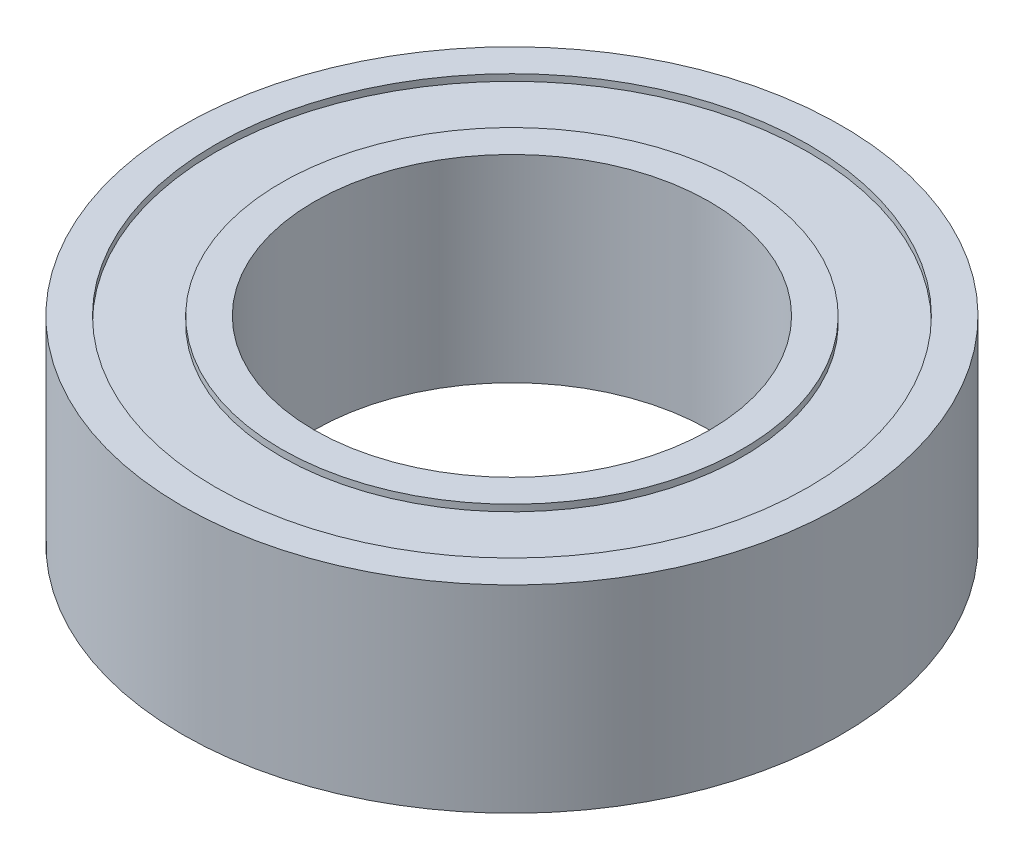
ISO-10303-21;
HEADER;
FILE_DESCRIPTION(('STEP AP214'),'2;1');
FILE_NAME('part.step','',(''),(''),'','','');
FILE_SCHEMA(('AUTOMOTIVE_DESIGN { 1 0 10303 214 1 1 1 1 }'));
ENDSEC;
DATA;
#1=APPLICATION_CONTEXT('core data for automotive mechanical design processes');
#2=APPLICATION_PROTOCOL_DEFINITION('international standard','automotive_design',2000,#1);
#3=PRODUCT_CONTEXT('',#1,'mechanical');
#4=PRODUCT('Part','Part','',(#3));
#5=PRODUCT_RELATED_PRODUCT_CATEGORY('part','',(#4));
#6=PRODUCT_DEFINITION_FORMATION('','',#4);
#7=PRODUCT_DEFINITION_CONTEXT('part definition',#1,'design');
#8=PRODUCT_DEFINITION('design','',#6,#7);
#9=PRODUCT_DEFINITION_SHAPE('','',#8);
#10=(LENGTH_UNIT() NAMED_UNIT(*) SI_UNIT(.MILLI.,.METRE.));
#11=(NAMED_UNIT(*) PLANE_ANGLE_UNIT() SI_UNIT($,.RADIAN.));
#12=(NAMED_UNIT(*) SI_UNIT($,.STERADIAN.) SOLID_ANGLE_UNIT());
#13=UNCERTAINTY_MEASURE_WITH_UNIT(LENGTH_MEASURE(1.E-05),#10,'distance_accuracy_value','');
#14=(GEOMETRIC_REPRESENTATION_CONTEXT(3) GLOBAL_UNCERTAINTY_ASSIGNED_CONTEXT((#13)) GLOBAL_UNIT_ASSIGNED_CONTEXT((#10,
#11,#12)) REPRESENTATION_CONTEXT('',''));
#15=CARTESIAN_POINT('',(0.,0.,0.));
#16=DIRECTION('',(0.,0.,1.));
#17=DIRECTION('',(1.,0.,0.));
#18=AXIS2_PLACEMENT_3D('',#15,#16,#17);
#19=CARTESIAN_POINT('',(0.,0.,0.));
#20=DIRECTION('',(0.,1.,0.));
#21=DIRECTION('',(0.,0.,1.));
#22=AXIS2_PLACEMENT_3D('',#19,#20,#21);
#23=PLANE('',#22);
#24=CARTESIAN_POINT('',(0.,0.,0.));
#25=DIRECTION('',(0.,1.,0.));
#26=DIRECTION('',(0.,0.,1.));
#27=AXIS2_PLACEMENT_3D('',#24,#25,#26);
#28=CIRCLE('',#27,3.);
#29=CARTESIAN_POINT('',(0.,0.,3.));
#30=VERTEX_POINT('',#29);
#31=EDGE_CURVE('E50',#30,#30,#28,.F.);
#32=ORIENTED_EDGE('',*,*,#31,.F.);
#33=EDGE_LOOP('',(#32));
#34=FACE_BOUND('',#33,.T.);
#35=CARTESIAN_POINT('',(0.,0.,0.));
#36=DIRECTION('',(0.,-1.,0.));
#37=DIRECTION('',(0.,0.,-1.));
#38=AXIS2_PLACEMENT_3D('',#35,#36,#37);
#39=CIRCLE('',#38,3.5);
#40=CARTESIAN_POINT('',(0.,0.,-3.5));
#41=VERTEX_POINT('',#40);
#42=EDGE_CURVE('E84',#41,#41,#39,.T.);
#43=ORIENTED_EDGE('',*,*,#42,.T.);
#44=EDGE_LOOP('',(#43));
#45=FACE_BOUND('',#44,.T.);
#46=ADVANCED_FACE('F37',(#34,#45),#23,.F.);
#47=CARTESIAN_POINT('',(0.,3.,0.));
#48=DIRECTION('',(0.,1.,0.));
#49=DIRECTION('',(0.,0.,1.));
#50=AXIS2_PLACEMENT_3D('',#47,#48,#49);
#51=PLANE('',#50);
#52=CARTESIAN_POINT('',(0.,3.,0.));
#53=DIRECTION('',(0.,1.,0.));
#54=DIRECTION('',(0.,0.,1.));
#55=AXIS2_PLACEMENT_3D('',#52,#53,#54);
#56=CIRCLE('',#55,3.);
#57=CARTESIAN_POINT('',(0.,3.,3.));
#58=VERTEX_POINT('',#57);
#59=EDGE_CURVE('E55',#58,#58,#56,.T.);
#60=ORIENTED_EDGE('',*,*,#59,.F.);
#61=EDGE_LOOP('',(#60));
#62=FACE_BOUND('',#61,.T.);
#63=CARTESIAN_POINT('',(0.,3.,0.));
#64=DIRECTION('',(0.,1.,0.));
#65=DIRECTION('',(0.,0.,1.));
#66=AXIS2_PLACEMENT_3D('',#63,#64,#65);
#67=CIRCLE('',#66,3.5);
#68=CARTESIAN_POINT('',(0.,3.,3.5));
#69=VERTEX_POINT('',#68);
#70=EDGE_CURVE('E68',#69,#69,#67,.T.);
#71=ORIENTED_EDGE('',*,*,#70,.T.);
#72=EDGE_LOOP('',(#71));
#73=FACE_BOUND('',#72,.T.);
#74=ADVANCED_FACE('F116',(#62,#73),#51,.T.);
#75=CARTESIAN_POINT('',(0.,3.,0.));
#76=DIRECTION('',(0.,-1.,0.));
#77=DIRECTION('',(0.,0.,-1.));
#78=AXIS2_PLACEMENT_3D('',#75,#76,#77);
#79=CYLINDRICAL_SURFACE('',#78,5.);
#80=CARTESIAN_POINT('',(0.,3.,0.));
#81=DIRECTION('',(0.,1.,0.));
#82=DIRECTION('',(0.,0.,1.));
#83=AXIS2_PLACEMENT_3D('',#80,#81,#82);
#84=CIRCLE('',#83,5.);
#85=CARTESIAN_POINT('',(0.,3.,5.));
#86=VERTEX_POINT('',#85);
#87=EDGE_CURVE('E10',#86,#86,#84,.T.);
#88=ORIENTED_EDGE('',*,*,#87,.F.);
#89=EDGE_LOOP('',(#88));
#90=FACE_BOUND('',#89,.T.);
#91=CARTESIAN_POINT('',(0.,0.,0.));
#92=DIRECTION('',(0.,1.,0.));
#93=DIRECTION('',(0.,0.,1.));
#94=AXIS2_PLACEMENT_3D('',#91,#92,#93);
#95=CIRCLE('',#94,5.);
#96=CARTESIAN_POINT('',(0.,0.,5.));
#97=VERTEX_POINT('',#96);
#98=EDGE_CURVE('E41',#97,#97,#95,.T.);
#99=ORIENTED_EDGE('',*,*,#98,.T.);
#100=EDGE_LOOP('',(#99));
#101=FACE_BOUND('',#100,.T.);
#102=ADVANCED_FACE('F39',(#90,#101),#79,.T.);
#103=CARTESIAN_POINT('',(0.,3.,0.));
#104=DIRECTION('',(0.,1.,0.));
#105=DIRECTION('',(0.,0.,1.));
#106=AXIS2_PLACEMENT_3D('',#103,#104,#105);
#107=CIRCLE('',#106,4.5);
#108=CARTESIAN_POINT('',(0.,3.,4.5));
#109=VERTEX_POINT('',#108);
#110=EDGE_CURVE('E60',#109,#109,#107,.T.);
#111=ORIENTED_EDGE('',*,*,#110,.F.);
#112=EDGE_LOOP('',(#111));
#113=FACE_BOUND('',#112,.T.);
#114=ORIENTED_EDGE('',*,*,#87,.T.);
#115=EDGE_LOOP('',(#114));
#116=FACE_BOUND('',#115,.T.);
#117=ADVANCED_FACE('F112',(#113,#116),#51,.T.);
#118=CARTESIAN_POINT('',(0.,0.,0.));
#119=DIRECTION('',(0.,-1.,0.));
#120=DIRECTION('',(0.,0.,-1.));
#121=AXIS2_PLACEMENT_3D('',#118,#119,#120);
#122=CIRCLE('',#121,4.5);
#123=CARTESIAN_POINT('',(0.,0.,-4.5));
#124=VERTEX_POINT('',#123);
#125=EDGE_CURVE('E76',#124,#124,#122,.T.);
#126=ORIENTED_EDGE('',*,*,#125,.F.);
#127=EDGE_LOOP('',(#126));
#128=FACE_BOUND('',#127,.T.);
#129=ORIENTED_EDGE('',*,*,#98,.F.);
#130=EDGE_LOOP('',(#129));
#131=FACE_BOUND('',#130,.T.);
#132=ADVANCED_FACE('F108',(#128,#131),#23,.F.);
#133=CARTESIAN_POINT('',(0.,-0.00100000000000013,0.));
#134=DIRECTION('',(0.,1.,0.));
#135=DIRECTION('',(0.,0.,1.));
#136=AXIS2_PLACEMENT_3D('',#133,#134,#135);
#137=CYLINDRICAL_SURFACE('',#136,3.);
#138=CARTESIAN_POINT('',(0.,3.,3.));
#139=CARTESIAN_POINT('',(0.,2.96875,3.));
#140=CARTESIAN_POINT('',(0.,2.9375,3.));
#141=CARTESIAN_POINT('',(0.,2.875,3.));
#142=CARTESIAN_POINT('',(0.,2.84375,3.));
#143=CARTESIAN_POINT('',(0.,2.78125,3.));
#144=CARTESIAN_POINT('',(0.,2.75,3.));
#145=CARTESIAN_POINT('',(0.,2.6875,3.));
#146=CARTESIAN_POINT('',(0.,2.65625,3.));
#147=CARTESIAN_POINT('',(0.,2.59375,3.));
#148=CARTESIAN_POINT('',(0.,2.5625,3.));
#149=CARTESIAN_POINT('',(0.,2.5,3.));
#150=CARTESIAN_POINT('',(0.,2.46875,3.));
#151=CARTESIAN_POINT('',(0.,2.40625,3.));
#152=CARTESIAN_POINT('',(0.,2.375,3.));
#153=CARTESIAN_POINT('',(0.,2.3125,3.));
#154=CARTESIAN_POINT('',(0.,2.28125,3.));
#155=CARTESIAN_POINT('',(0.,2.21875,3.));
#156=CARTESIAN_POINT('',(0.,2.1875,3.));
#157=CARTESIAN_POINT('',(0.,2.125,3.));
#158=CARTESIAN_POINT('',(0.,2.09375,3.));
#159=CARTESIAN_POINT('',(0.,2.03125,3.));
#160=CARTESIAN_POINT('',(0.,2.,3.));
#161=CARTESIAN_POINT('',(0.,1.9375,3.));
#162=CARTESIAN_POINT('',(0.,1.90625,3.));
#163=CARTESIAN_POINT('',(0.,1.84375,3.));
#164=CARTESIAN_POINT('',(0.,1.8125,3.));
#165=CARTESIAN_POINT('',(0.,1.75,3.));
#166=CARTESIAN_POINT('',(0.,1.71875,3.));
#167=CARTESIAN_POINT('',(0.,1.65625,3.));
#168=CARTESIAN_POINT('',(0.,1.625,3.));
#169=CARTESIAN_POINT('',(0.,1.5625,3.));
#170=CARTESIAN_POINT('',(0.,1.53125,3.));
#171=CARTESIAN_POINT('',(0.,1.46875,3.));
#172=CARTESIAN_POINT('',(0.,1.4375,3.));
#173=CARTESIAN_POINT('',(0.,1.375,3.));
#174=CARTESIAN_POINT('',(0.,1.34375,3.));
#175=CARTESIAN_POINT('',(0.,1.28125,3.));
#176=CARTESIAN_POINT('',(0.,1.25,3.));
#177=CARTESIAN_POINT('',(0.,1.1875,3.));
#178=CARTESIAN_POINT('',(0.,1.15625,3.));
#179=CARTESIAN_POINT('',(0.,1.09375,3.));
#180=CARTESIAN_POINT('',(0.,1.0625,3.));
#181=CARTESIAN_POINT('',(0.,1.,3.));
#182=CARTESIAN_POINT('',(0.,0.96875,3.));
#183=CARTESIAN_POINT('',(0.,0.90625,3.));
#184=CARTESIAN_POINT('',(0.,0.875,3.));
#185=CARTESIAN_POINT('',(0.,0.8125,3.));
#186=CARTESIAN_POINT('',(0.,0.78125,3.));
#187=CARTESIAN_POINT('',(0.,0.71875,3.));
#188=CARTESIAN_POINT('',(0.,0.6875,3.));
#189=CARTESIAN_POINT('',(0.,0.625,3.));
#190=CARTESIAN_POINT('',(0.,0.59375,3.));
#191=CARTESIAN_POINT('',(0.,0.53125,3.));
#192=CARTESIAN_POINT('',(0.,0.5,3.));
#193=CARTESIAN_POINT('',(0.,0.4375,3.));
#194=CARTESIAN_POINT('',(0.,0.40625,3.));
#195=CARTESIAN_POINT('',(0.,0.34375,3.));
#196=CARTESIAN_POINT('',(0.,0.3125,3.));
#197=CARTESIAN_POINT('',(0.,0.25,3.));
#198=CARTESIAN_POINT('',(0.,0.21875,3.));
#199=CARTESIAN_POINT('',(0.,0.15625,3.));
#200=CARTESIAN_POINT('',(0.,0.125,3.));
#201=CARTESIAN_POINT('',(0.,0.0625000000000001,3.));
#202=CARTESIAN_POINT('',(0.,0.0312500000000001,3.));
#203=CARTESIAN_POINT('',(0.,0.,3.));
#204=B_SPLINE_CURVE_WITH_KNOTS('',3,(#138,#139,#140,#141,#142,#143,#144,#145,#146,#147,#148,
#149,#150,#151,#152,#153,#154,#155,#156,#157,#158,#159,#160,#161,#162,#163,#164,#165,#166,#167,
#168,#169,#170,#171,#172,#173,#174,#175,#176,#177,#178,#179,#180,#181,#182,#183,#184,#185,#186,
#187,#188,#189,#190,#191,#192,#193,#194,#195,#196,#197,#198,#199,#200,#201,#202,#203),
.UNSPECIFIED.,.F.,.F.,(4,2,2,2,2,2,2,2,2,2,2,2,2,2,2,2,2,2,2,2,2,2,2,2,2,2,2,2,2,2,2,2,4),(0.,
0.0937500000000001,0.1875,0.28125,0.375,0.46875,0.5625,0.65625,0.75,0.84375,0.9375,1.03125,
1.125,1.21875,1.3125,1.40625,1.5,1.59375,1.6875,1.78125,1.875,1.96875,2.0625,2.15625,2.25,
2.34375,2.4375,2.53125,2.625,2.71875,2.8125,2.90625,3.),.UNSPECIFIED.);
#205=EDGE_CURVE('BSEAM111',#58,#30,#204,.T.);
#206=ORIENTED_EDGE('',*,*,#59,.T.);
#207=ORIENTED_EDGE('',*,*,#31,.T.);
#208=ORIENTED_EDGE('',*,*,#205,.T.);
#209=ORIENTED_EDGE('',*,*,#205,.F.);
#210=EDGE_LOOP('',(#206,#208,#207,#209));
#211=FACE_BOUND('',#210,.T.);
#212=ADVANCED_FACE('F111',(#211),#137,.F.);
#213=CARTESIAN_POINT('',(0.,2.9,0.));
#214=DIRECTION('',(0.,1.,0.));
#215=DIRECTION('',(0.,0.,1.));
#216=AXIS2_PLACEMENT_3D('',#213,#214,#215);
#217=CYLINDRICAL_SURFACE('',#216,4.5);
#218=CARTESIAN_POINT('',(0.,2.9,0.));
#219=DIRECTION('',(0.,1.,0.));
#220=DIRECTION('',(0.,0.,1.));
#221=AXIS2_PLACEMENT_3D('',#218,#219,#220);
#222=CIRCLE('',#221,4.5);
#223=CARTESIAN_POINT('',(0.,2.9,4.5));
#224=VERTEX_POINT('',#223);
#225=EDGE_CURVE('E59',#224,#224,#222,.T.);
#226=ORIENTED_EDGE('',*,*,#225,.F.);
#227=EDGE_LOOP('',(#226));
#228=FACE_BOUND('',#227,.T.);
#229=ORIENTED_EDGE('',*,*,#110,.T.);
#230=EDGE_LOOP('',(#229));
#231=FACE_BOUND('',#230,.T.);
#232=ADVANCED_FACE('F134',(#228,#231),#217,.F.);
#233=CARTESIAN_POINT('',(0.,2.9,0.));
#234=DIRECTION('',(0.,1.,0.));
#235=DIRECTION('',(0.,0.,1.));
#236=AXIS2_PLACEMENT_3D('',#233,#234,#235);
#237=PLANE('',#236);
#238=CARTESIAN_POINT('',(0.,2.9,0.));
#239=DIRECTION('',(0.,1.,0.));
#240=DIRECTION('',(0.,0.,1.));
#241=AXIS2_PLACEMENT_3D('',#238,#239,#240);
#242=CIRCLE('',#241,3.5);
#243=CARTESIAN_POINT('',(0.,2.9,3.5));
#244=VERTEX_POINT('',#243);
#245=EDGE_CURVE('E64',#244,#244,#242,.T.);
#246=ORIENTED_EDGE('',*,*,#245,.F.);
#247=EDGE_LOOP('',(#246));
#248=FACE_BOUND('',#247,.T.);
#249=ORIENTED_EDGE('',*,*,#225,.T.);
#250=EDGE_LOOP('',(#249));
#251=FACE_BOUND('',#250,.T.);
#252=ADVANCED_FACE('F138',(#248,#251),#237,.T.);
#253=CARTESIAN_POINT('',(0.,2.9,0.));
#254=DIRECTION('',(0.,1.,0.));
#255=DIRECTION('',(0.,0.,1.));
#256=AXIS2_PLACEMENT_3D('',#253,#254,#255);
#257=CYLINDRICAL_SURFACE('',#256,3.5);
#258=ORIENTED_EDGE('',*,*,#245,.T.);
#259=EDGE_LOOP('',(#258));
#260=FACE_BOUND('',#259,.T.);
#261=ORIENTED_EDGE('',*,*,#70,.F.);
#262=EDGE_LOOP('',(#261));
#263=FACE_BOUND('',#262,.T.);
#264=ADVANCED_FACE('F104',(#260,#263),#257,.T.);
#265=CARTESIAN_POINT('',(0.,0.1,0.));
#266=DIRECTION('',(0.,-1.,0.));
#267=DIRECTION('',(0.,0.,-1.));
#268=AXIS2_PLACEMENT_3D('',#265,#266,#267);
#269=CYLINDRICAL_SURFACE('',#268,4.5);
#270=CARTESIAN_POINT('',(0.,0.1,0.));
#271=DIRECTION('',(0.,-1.,0.));
#272=DIRECTION('',(0.,0.,-1.));
#273=AXIS2_PLACEMENT_3D('',#270,#271,#272);
#274=CIRCLE('',#273,4.5);
#275=CARTESIAN_POINT('',(0.,0.1,-4.5));
#276=VERTEX_POINT('',#275);
#277=EDGE_CURVE('E72',#276,#276,#274,.T.);
#278=ORIENTED_EDGE('',*,*,#277,.F.);
#279=EDGE_LOOP('',(#278));
#280=FACE_BOUND('',#279,.T.);
#281=ORIENTED_EDGE('',*,*,#125,.T.);
#282=EDGE_LOOP('',(#281));
#283=FACE_BOUND('',#282,.T.);
#284=ADVANCED_FACE('F98',(#280,#283),#269,.F.);
#285=CARTESIAN_POINT('',(0.,0.1,0.));
#286=DIRECTION('',(0.,-1.,0.));
#287=DIRECTION('',(0.,0.,-1.));
#288=AXIS2_PLACEMENT_3D('',#285,#286,#287);
#289=PLANE('',#288);
#290=CARTESIAN_POINT('',(0.,0.1,0.));
#291=DIRECTION('',(0.,-1.,0.));
#292=DIRECTION('',(0.,0.,-1.));
#293=AXIS2_PLACEMENT_3D('',#290,#291,#292);
#294=CIRCLE('',#293,3.5);
#295=CARTESIAN_POINT('',(0.,0.1,-3.5));
#296=VERTEX_POINT('',#295);
#297=EDGE_CURVE('E80',#296,#296,#294,.T.);
#298=ORIENTED_EDGE('',*,*,#297,.F.);
#299=EDGE_LOOP('',(#298));
#300=FACE_BOUND('',#299,.T.);
#301=ORIENTED_EDGE('',*,*,#277,.T.);
#302=EDGE_LOOP('',(#301));
#303=FACE_BOUND('',#302,.T.);
#304=ADVANCED_FACE('F95',(#300,#303),#289,.T.);
#305=CARTESIAN_POINT('',(0.,0.1,0.));
#306=DIRECTION('',(0.,-1.,0.));
#307=DIRECTION('',(0.,0.,-1.));
#308=AXIS2_PLACEMENT_3D('',#305,#306,#307);
#309=CYLINDRICAL_SURFACE('',#308,3.5);
#310=ORIENTED_EDGE('',*,*,#297,.T.);
#311=EDGE_LOOP('',(#310));
#312=FACE_BOUND('',#311,.T.);
#313=ORIENTED_EDGE('',*,*,#42,.F.);
#314=EDGE_LOOP('',(#313));
#315=FACE_BOUND('',#314,.T.);
#316=ADVANCED_FACE('F92',(#312,#315),#309,.T.);
#317=CLOSED_SHELL('',(#46,#74,#102,#117,#132,#212,#232,#252,#264,#284,#304,#316));
#318=MANIFOLD_SOLID_BREP('B2',#317);
#319=ADVANCED_BREP_SHAPE_REPRESENTATION('',(#18,#318),#14);
#320=SHAPE_DEFINITION_REPRESENTATION(#9,#319);
ENDSEC;
END-ISO-10303-21;
